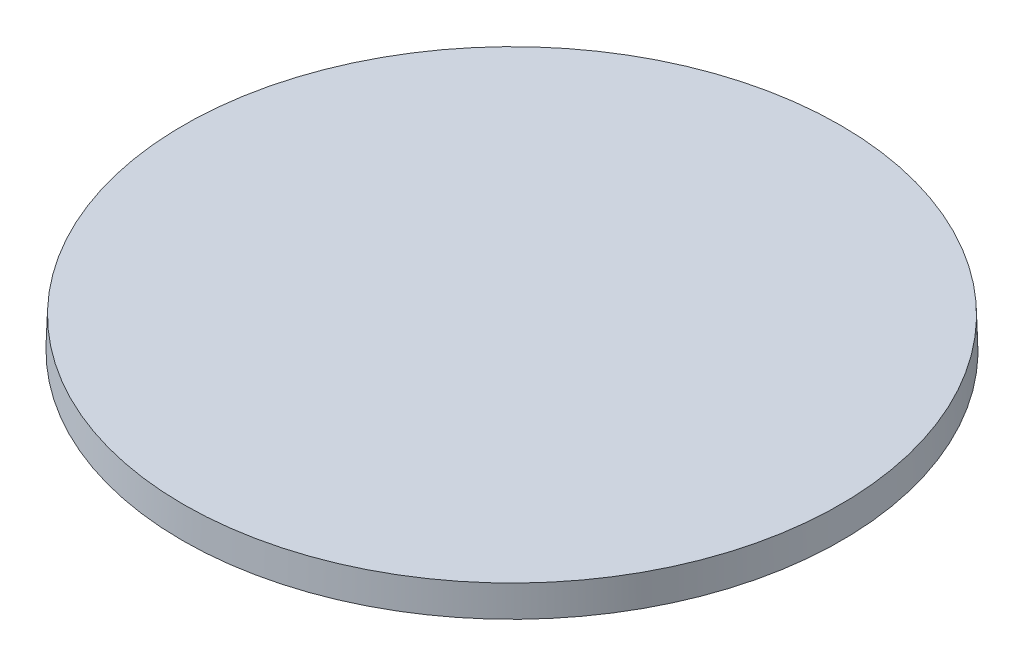
ISO-10303-21;
HEADER;
FILE_DESCRIPTION(('STEP AP214'),'2;1');
FILE_NAME('part.step','',(''),(''),'','','');
FILE_SCHEMA(('AUTOMOTIVE_DESIGN { 1 0 10303 214 1 1 1 1 }'));
ENDSEC;
DATA;
#1=APPLICATION_CONTEXT('core data for automotive mechanical design processes');
#2=APPLICATION_PROTOCOL_DEFINITION('international standard','automotive_design',2000,#1);
#3=PRODUCT_CONTEXT('',#1,'mechanical');
#4=PRODUCT('Part','Part','',(#3));
#5=PRODUCT_RELATED_PRODUCT_CATEGORY('part','',(#4));
#6=PRODUCT_DEFINITION_FORMATION('','',#4);
#7=PRODUCT_DEFINITION_CONTEXT('part definition',#1,'design');
#8=PRODUCT_DEFINITION('design','',#6,#7);
#9=PRODUCT_DEFINITION_SHAPE('','',#8);
#10=(LENGTH_UNIT() NAMED_UNIT(*) SI_UNIT(.MILLI.,.METRE.));
#11=(NAMED_UNIT(*) PLANE_ANGLE_UNIT() SI_UNIT($,.RADIAN.));
#12=(NAMED_UNIT(*) SI_UNIT($,.STERADIAN.) SOLID_ANGLE_UNIT());
#13=UNCERTAINTY_MEASURE_WITH_UNIT(LENGTH_MEASURE(1.E-05),#10,'distance_accuracy_value','');
#14=(GEOMETRIC_REPRESENTATION_CONTEXT(3) GLOBAL_UNCERTAINTY_ASSIGNED_CONTEXT((#13)) GLOBAL_UNIT_ASSIGNED_CONTEXT((#10,
#11,#12)) REPRESENTATION_CONTEXT('',''));
#15=CARTESIAN_POINT('',(0.,0.,0.));
#16=DIRECTION('',(0.,0.,1.));
#17=DIRECTION('',(1.,0.,0.));
#18=AXIS2_PLACEMENT_3D('',#15,#16,#17);
#19=CARTESIAN_POINT('',(0.,0.,0.));
#20=DIRECTION('',(0.,-1.,0.));
#21=DIRECTION('',(0.,0.,1.));
#22=AXIS2_PLACEMENT_3D('',#19,#20,#21);
#23=CONICAL_SURFACE('',#22,16.12,0.0349065850398866);
#24=CARTESIAN_POINT('',(0.,1.5,0.));
#25=DIRECTION('',(0.,1.,0.));
#26=DIRECTION('',(0.,0.,1.));
#27=AXIS2_PLACEMENT_3D('',#24,#25,#26);
#28=CIRCLE('',#27,16.0676188457624);
#29=CARTESIAN_POINT('',(0.,1.5,16.0676188457624));
#30=VERTEX_POINT('',#29);
#31=EDGE_CURVE('E10',#30,#30,#28,.T.);
#32=ORIENTED_EDGE('',*,*,#31,.F.);
#33=EDGE_LOOP('',(#32));
#34=FACE_BOUND('',#33,.T.);
#35=CARTESIAN_POINT('',(0.,0.,0.));
#36=DIRECTION('',(0.,1.,0.));
#37=DIRECTION('',(0.,0.,1.));
#38=AXIS2_PLACEMENT_3D('',#35,#36,#37);
#39=CIRCLE('',#38,16.12);
#40=CARTESIAN_POINT('',(0.,0.,16.12));
#41=VERTEX_POINT('',#40);
#42=EDGE_CURVE('E41',#41,#41,#39,.T.);
#43=ORIENTED_EDGE('',*,*,#42,.T.);
#44=EDGE_LOOP('',(#43));
#45=FACE_BOUND('',#44,.T.);
#46=ADVANCED_FACE('F35',(#34,#45),#23,.T.);
#47=CARTESIAN_POINT('',(0.,1.5,0.));
#48=DIRECTION('',(0.,1.,0.));
#49=DIRECTION('',(0.,0.,1.));
#50=AXIS2_PLACEMENT_3D('',#47,#48,#49);
#51=PLANE('',#50);
#52=ORIENTED_EDGE('',*,*,#31,.T.);
#53=EDGE_LOOP('',(#52));
#54=FACE_BOUND('',#53,.T.);
#55=ADVANCED_FACE('F50',(#54),#51,.T.);
#56=CARTESIAN_POINT('',(0.,0.,0.));
#57=DIRECTION('',(0.,1.,0.));
#58=DIRECTION('',(0.,0.,1.));
#59=AXIS2_PLACEMENT_3D('',#56,#57,#58);
#60=PLANE('',#59);
#61=ORIENTED_EDGE('',*,*,#42,.F.);
#62=EDGE_LOOP('',(#61));
#63=FACE_BOUND('',#62,.T.);
#64=ADVANCED_FACE('F48',(#63),#60,.F.);
#65=CLOSED_SHELL('',(#46,#55,#64));
#66=MANIFOLD_SOLID_BREP('B2',#65);
#67=ADVANCED_BREP_SHAPE_REPRESENTATION('',(#18,#66),#14);
#68=SHAPE_DEFINITION_REPRESENTATION(#9,#67);
ENDSEC;
END-ISO-10303-21;
